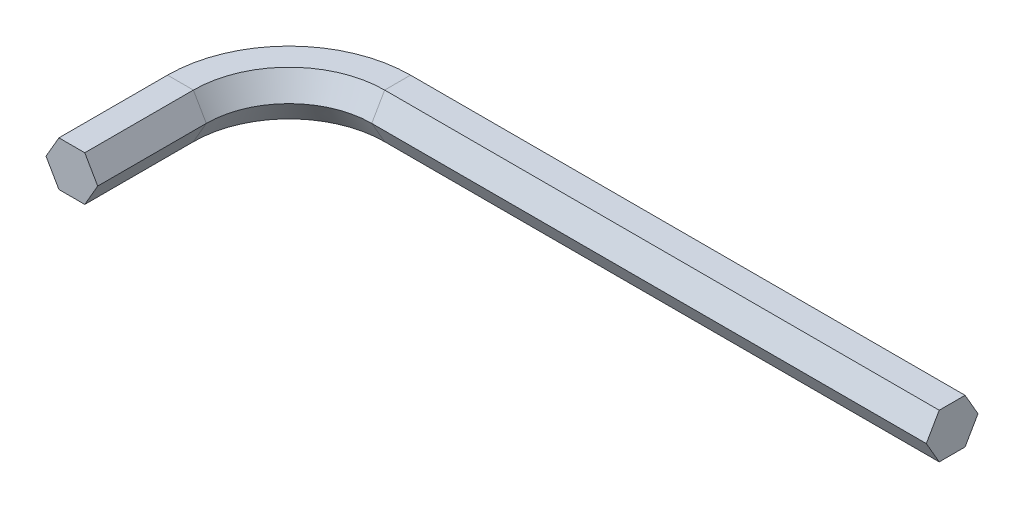
ISO-10303-21;
HEADER;
FILE_DESCRIPTION(('STEP AP214'),'2;1');
FILE_NAME('part.step','',(''),(''),'','','');
FILE_SCHEMA(('AUTOMOTIVE_DESIGN { 1 0 10303 214 1 1 1 1 }'));
ENDSEC;
DATA;
#1=APPLICATION_CONTEXT('core data for automotive mechanical design processes');
#2=APPLICATION_PROTOCOL_DEFINITION('international standard','automotive_design',2000,#1);
#3=PRODUCT_CONTEXT('',#1,'mechanical');
#4=PRODUCT('Part','Part','',(#3));
#5=PRODUCT_RELATED_PRODUCT_CATEGORY('part','',(#4));
#6=PRODUCT_DEFINITION_FORMATION('','',#4);
#7=PRODUCT_DEFINITION_CONTEXT('part definition',#1,'design');
#8=PRODUCT_DEFINITION('design','',#6,#7);
#9=PRODUCT_DEFINITION_SHAPE('','',#8);
#10=(LENGTH_UNIT() NAMED_UNIT(*) SI_UNIT(.MILLI.,.METRE.));
#11=(NAMED_UNIT(*) PLANE_ANGLE_UNIT() SI_UNIT($,.RADIAN.));
#12=(NAMED_UNIT(*) SI_UNIT($,.STERADIAN.) SOLID_ANGLE_UNIT());
#13=UNCERTAINTY_MEASURE_WITH_UNIT(LENGTH_MEASURE(1.E-05),#10,'distance_accuracy_value','');
#14=(GEOMETRIC_REPRESENTATION_CONTEXT(3) GLOBAL_UNCERTAINTY_ASSIGNED_CONTEXT((#13)) GLOBAL_UNIT_ASSIGNED_CONTEXT((#10,
#11,#12)) REPRESENTATION_CONTEXT('',''));
#15=CARTESIAN_POINT('',(0.,0.,0.));
#16=DIRECTION('',(0.,0.,1.));
#17=DIRECTION('',(1.,0.,0.));
#18=AXIS2_PLACEMENT_3D('',#15,#16,#17);
#19=CARTESIAN_POINT('',(0.,0.,0.));
#20=DIRECTION('',(0.,0.,1.));
#21=DIRECTION('',(1.,0.,0.));
#22=AXIS2_PLACEMENT_3D('',#19,#20,#21);
#23=PLANE('',#22);
#24=DIRECTION('',(-0.5,0.866025403784439,0.));
#25=VECTOR('',#24,1.);
#26=CARTESIAN_POINT('',(6.66666666666667,0.,0.));
#27=LINE('',#26,#25);
#28=CARTESIAN_POINT('',(6.66666666666667,0.,0.));
#29=VERTEX_POINT('',#28);
#30=CARTESIAN_POINT('',(3.33333333333333,5.77350269189626,0.));
#31=VERTEX_POINT('',#30);
#32=EDGE_CURVE('E188',#29,#31,#27,.T.);
#33=ORIENTED_EDGE('',*,*,#32,.T.);
#34=DIRECTION('',(-1.,0.,0.));
#35=VECTOR('',#34,1.);
#36=CARTESIAN_POINT('',(3.33333333333333,5.77350269189626,0.));
#37=LINE('',#36,#35);
#38=CARTESIAN_POINT('',(-3.33333333333333,5.77350269189626,0.));
#39=VERTEX_POINT('',#38);
#40=EDGE_CURVE('E147',#31,#39,#37,.T.);
#41=ORIENTED_EDGE('',*,*,#40,.T.);
#42=DIRECTION('',(-0.5,-0.866025403784439,0.));
#43=VECTOR('',#42,1.);
#44=CARTESIAN_POINT('',(-3.33333333333333,5.77350269189626,0.));
#45=LINE('',#44,#43);
#46=CARTESIAN_POINT('',(-6.66666666666667,0.,0.));
#47=VERTEX_POINT('',#46);
#48=EDGE_CURVE('E139',#39,#47,#45,.T.);
#49=ORIENTED_EDGE('',*,*,#48,.T.);
#50=DIRECTION('',(0.5,-0.866025403784439,0.));
#51=VECTOR('',#50,1.);
#52=CARTESIAN_POINT('',(-6.66666666666667,0.,0.));
#53=LINE('',#52,#51);
#54=CARTESIAN_POINT('',(-3.33333333333334,-5.77350269189626,0.));
#55=VERTEX_POINT('',#54);
#56=EDGE_CURVE('E132',#47,#55,#53,.T.);
#57=ORIENTED_EDGE('',*,*,#56,.T.);
#58=DIRECTION('',(1.,0.,0.));
#59=VECTOR('',#58,1.);
#60=CARTESIAN_POINT('',(-3.33333333333334,-5.77350269189626,0.));
#61=LINE('',#60,#59);
#62=CARTESIAN_POINT('',(3.33333333333333,-5.77350269189626,0.));
#63=VERTEX_POINT('',#62);
#64=EDGE_CURVE('E213',#55,#63,#61,.T.);
#65=ORIENTED_EDGE('',*,*,#64,.T.);
#66=DIRECTION('',(0.5,0.866025403784439,0.));
#67=VECTOR('',#66,1.);
#68=CARTESIAN_POINT('',(3.33333333333333,-5.77350269189626,0.));
#69=LINE('',#68,#67);
#70=EDGE_CURVE('E227',#63,#29,#69,.T.);
#71=ORIENTED_EDGE('',*,*,#70,.T.);
#72=EDGE_LOOP('',(#33,#41,#49,#57,#65,#71));
#73=FACE_BOUND('',#72,.T.);
#74=ADVANCED_FACE('F33',(#73),#23,.T.);
#75=CARTESIAN_POINT('',(171.,0.,-56.));
#76=DIRECTION('',(-1.,0.,0.));
#77=DIRECTION('',(0.,0.,1.));
#78=AXIS2_PLACEMENT_3D('',#75,#76,#77);
#79=PLANE('',#78);
#80=DIRECTION('',(0.,0.866025403784439,-0.5));
#81=VECTOR('',#80,1.);
#82=CARTESIAN_POINT('',(171.,0.,-49.3333333333333));
#83=LINE('',#82,#81);
#84=CARTESIAN_POINT('',(171.,0.,-49.3333333333333));
#85=VERTEX_POINT('',#84);
#86=CARTESIAN_POINT('',(171.,5.77350269189626,-52.6666666666667));
#87=VERTEX_POINT('',#86);
#88=EDGE_CURVE('E161',#85,#87,#83,.T.);
#89=ORIENTED_EDGE('',*,*,#88,.F.);
#90=DIRECTION('',(0.,0.866025403784439,0.5));
#91=VECTOR('',#90,1.);
#92=CARTESIAN_POINT('',(171.,-5.77350269189626,-52.6666666666667));
#93=LINE('',#92,#91);
#94=CARTESIAN_POINT('',(171.,-5.77350269189626,-52.6666666666667));
#95=VERTEX_POINT('',#94);
#96=EDGE_CURVE('E11',#95,#85,#93,.T.);
#97=ORIENTED_EDGE('',*,*,#96,.F.);
#98=DIRECTION('',(0.,0.,1.));
#99=VECTOR('',#98,1.);
#100=CARTESIAN_POINT('',(171.,-5.77350269189626,-59.3333333333333));
#101=LINE('',#100,#99);
#102=CARTESIAN_POINT('',(171.,-5.77350269189626,-59.3333333333333));
#103=VERTEX_POINT('',#102);
#104=EDGE_CURVE('E47',#103,#95,#101,.T.);
#105=ORIENTED_EDGE('',*,*,#104,.F.);
#106=DIRECTION('',(0.,-0.866025403784439,0.5));
#107=VECTOR('',#106,1.);
#108=CARTESIAN_POINT('',(171.,0.,-62.6666666666667));
#109=LINE('',#108,#107);
#110=CARTESIAN_POINT('',(171.,0.,-62.6666666666667));
#111=VERTEX_POINT('',#110);
#112=EDGE_CURVE('E56',#111,#103,#109,.T.);
#113=ORIENTED_EDGE('',*,*,#112,.F.);
#114=DIRECTION('',(0.,-0.866025403784439,-0.5));
#115=VECTOR('',#114,1.);
#116=CARTESIAN_POINT('',(171.,5.77350269189626,-59.3333333333333));
#117=LINE('',#116,#115);
#118=CARTESIAN_POINT('',(171.,5.77350269189626,-59.3333333333333));
#119=VERTEX_POINT('',#118);
#120=EDGE_CURVE('E174',#119,#111,#117,.T.);
#121=ORIENTED_EDGE('',*,*,#120,.F.);
#122=DIRECTION('',(0.,0.,-1.));
#123=VECTOR('',#122,1.);
#124=CARTESIAN_POINT('',(171.,5.77350269189626,-52.6666666666667));
#125=LINE('',#124,#123);
#126=EDGE_CURVE('E172',#87,#119,#125,.T.);
#127=ORIENTED_EDGE('',*,*,#126,.F.);
#128=EDGE_LOOP('',(#89,#97,#105,#113,#121,#127));
#129=FACE_BOUND('',#128,.T.);
#130=ADVANCED_FACE('F173',(#129),#79,.F.);
#131=CARTESIAN_POINT('',(6.66666666666667,0.,0.));
#132=DIRECTION('',(-0.866025403784439,-0.5,0.));
#133=DIRECTION('',(0.5,-0.866025403784439,0.));
#134=AXIS2_PLACEMENT_3D('',#131,#132,#133);
#135=PLANE('',#134);
#136=DIRECTION('',(0.,0.,-1.));
#137=VECTOR('',#136,1.);
#138=CARTESIAN_POINT('',(3.33333333333333,5.77350269189626,0.));
#139=LINE('',#138,#137);
#140=CARTESIAN_POINT('',(3.33333333333333,5.77350269189626,-28.));
#141=VERTEX_POINT('',#140);
#142=EDGE_CURVE('E193',#31,#141,#139,.T.);
#143=ORIENTED_EDGE('',*,*,#142,.F.);
#144=ORIENTED_EDGE('',*,*,#32,.F.);
#145=DIRECTION('',(0.,0.,-1.));
#146=VECTOR('',#145,1.);
#147=CARTESIAN_POINT('',(6.66666666666667,0.,0.));
#148=LINE('',#147,#146);
#149=CARTESIAN_POINT('',(6.66666666666667,0.,-28.));
#150=VERTEX_POINT('',#149);
#151=EDGE_CURVE('E243',#29,#150,#148,.T.);
#152=ORIENTED_EDGE('',*,*,#151,.T.);
#153=DIRECTION('',(-0.5,0.866025403784439,0.));
#154=VECTOR('',#153,1.);
#155=CARTESIAN_POINT('',(6.66666666666667,0.,-28.));
#156=LINE('',#155,#154);
#157=EDGE_CURVE('E259',#150,#141,#156,.T.);
#158=ORIENTED_EDGE('',*,*,#157,.T.);
#159=EDGE_LOOP('',(#143,#144,#152,#158));
#160=FACE_BOUND('',#159,.T.);
#161=ADVANCED_FACE('F270',(#160),#135,.F.);
#162=CARTESIAN_POINT('',(3.33333333333333,5.77350269189626,0.));
#163=DIRECTION('',(0.,-1.,0.));
#164=DIRECTION('',(1.,0.,0.));
#165=AXIS2_PLACEMENT_3D('',#162,#163,#164);
#166=PLANE('',#165);
#167=DIRECTION('',(0.,0.,-1.));
#168=VECTOR('',#167,1.);
#169=CARTESIAN_POINT('',(-3.33333333333333,5.77350269189626,0.));
#170=LINE('',#169,#168);
#171=CARTESIAN_POINT('',(-3.33333333333333,5.77350269189626,-28.));
#172=VERTEX_POINT('',#171);
#173=EDGE_CURVE('E192',#39,#172,#170,.T.);
#174=ORIENTED_EDGE('',*,*,#173,.F.);
#175=ORIENTED_EDGE('',*,*,#40,.F.);
#176=ORIENTED_EDGE('',*,*,#142,.T.);
#177=DIRECTION('',(-1.,0.,0.));
#178=VECTOR('',#177,1.);
#179=CARTESIAN_POINT('',(3.33333333333333,5.77350269189626,-28.));
#180=LINE('',#179,#178);
#181=EDGE_CURVE('E189',#141,#172,#180,.T.);
#182=ORIENTED_EDGE('',*,*,#181,.T.);
#183=EDGE_LOOP('',(#174,#175,#176,#182));
#184=FACE_BOUND('',#183,.T.);
#185=ADVANCED_FACE('F271',(#184),#166,.F.);
#186=CARTESIAN_POINT('',(-3.33333333333333,5.77350269189626,0.));
#187=DIRECTION('',(0.866025403784439,-0.5,0.));
#188=DIRECTION('',(0.5,0.866025403784439,0.));
#189=AXIS2_PLACEMENT_3D('',#186,#187,#188);
#190=PLANE('',#189);
#191=DIRECTION('',(0.,0.,-1.));
#192=VECTOR('',#191,1.);
#193=CARTESIAN_POINT('',(-6.66666666666667,0.,0.));
#194=LINE('',#193,#192);
#195=CARTESIAN_POINT('',(-6.66666666666667,0.,-28.));
#196=VERTEX_POINT('',#195);
#197=EDGE_CURVE('E204',#47,#196,#194,.T.);
#198=ORIENTED_EDGE('',*,*,#197,.F.);
#199=ORIENTED_EDGE('',*,*,#48,.F.);
#200=ORIENTED_EDGE('',*,*,#173,.T.);
#201=DIRECTION('',(-0.5,-0.866025403784439,0.));
#202=VECTOR('',#201,1.);
#203=CARTESIAN_POINT('',(-3.33333333333333,5.77350269189626,-28.));
#204=LINE('',#203,#202);
#205=EDGE_CURVE('E195',#172,#196,#204,.T.);
#206=ORIENTED_EDGE('',*,*,#205,.T.);
#207=EDGE_LOOP('',(#198,#199,#200,#206));
#208=FACE_BOUND('',#207,.T.);
#209=ADVANCED_FACE('F324',(#208),#190,.F.);
#210=CARTESIAN_POINT('',(-6.66666666666667,0.,0.));
#211=DIRECTION('',(0.866025403784439,0.5,0.));
#212=DIRECTION('',(-0.5,0.866025403784439,0.));
#213=AXIS2_PLACEMENT_3D('',#210,#211,#212);
#214=PLANE('',#213);
#215=DIRECTION('',(0.,0.,-1.));
#216=VECTOR('',#215,1.);
#217=CARTESIAN_POINT('',(-3.33333333333334,-5.77350269189626,0.));
#218=LINE('',#217,#216);
#219=CARTESIAN_POINT('',(-3.33333333333334,-5.77350269189626,-28.));
#220=VERTEX_POINT('',#219);
#221=EDGE_CURVE('E216',#55,#220,#218,.T.);
#222=ORIENTED_EDGE('',*,*,#221,.F.);
#223=ORIENTED_EDGE('',*,*,#56,.F.);
#224=ORIENTED_EDGE('',*,*,#197,.T.);
#225=DIRECTION('',(0.5,-0.866025403784439,0.));
#226=VECTOR('',#225,1.);
#227=CARTESIAN_POINT('',(-6.66666666666667,0.,-28.));
#228=LINE('',#227,#226);
#229=EDGE_CURVE('E206',#196,#220,#228,.T.);
#230=ORIENTED_EDGE('',*,*,#229,.T.);
#231=EDGE_LOOP('',(#222,#223,#224,#230));
#232=FACE_BOUND('',#231,.T.);
#233=ADVANCED_FACE('F332',(#232),#214,.F.);
#234=CARTESIAN_POINT('',(-3.33333333333334,-5.77350269189626,0.));
#235=DIRECTION('',(0.,1.,0.));
#236=DIRECTION('',(-1.,0.,0.));
#237=AXIS2_PLACEMENT_3D('',#234,#235,#236);
#238=PLANE('',#237);
#239=DIRECTION('',(0.,0.,-1.));
#240=VECTOR('',#239,1.);
#241=CARTESIAN_POINT('',(3.33333333333333,-5.77350269189626,0.));
#242=LINE('',#241,#240);
#243=CARTESIAN_POINT('',(3.33333333333333,-5.77350269189626,-28.));
#244=VERTEX_POINT('',#243);
#245=EDGE_CURVE('E230',#63,#244,#242,.T.);
#246=ORIENTED_EDGE('',*,*,#245,.F.);
#247=ORIENTED_EDGE('',*,*,#64,.F.);
#248=ORIENTED_EDGE('',*,*,#221,.T.);
#249=DIRECTION('',(1.,0.,0.));
#250=VECTOR('',#249,1.);
#251=CARTESIAN_POINT('',(-3.33333333333334,-5.77350269189626,-28.));
#252=LINE('',#251,#250);
#253=EDGE_CURVE('E219',#220,#244,#252,.T.);
#254=ORIENTED_EDGE('',*,*,#253,.T.);
#255=EDGE_LOOP('',(#246,#247,#248,#254));
#256=FACE_BOUND('',#255,.T.);
#257=ADVANCED_FACE('F341',(#256),#238,.F.);
#258=CARTESIAN_POINT('',(3.33333333333333,-5.77350269189626,0.));
#259=DIRECTION('',(-0.866025403784439,0.5,0.));
#260=DIRECTION('',(-0.5,-0.866025403784439,0.));
#261=AXIS2_PLACEMENT_3D('',#258,#259,#260);
#262=PLANE('',#261);
#263=DIRECTION('',(0.5,0.866025403784439,0.));
#264=VECTOR('',#263,1.);
#265=CARTESIAN_POINT('',(3.33333333333333,-5.77350269189626,-28.));
#266=LINE('',#265,#264);
#267=EDGE_CURVE('E233',#244,#150,#266,.T.);
#268=ORIENTED_EDGE('',*,*,#267,.T.);
#269=ORIENTED_EDGE('',*,*,#151,.F.);
#270=ORIENTED_EDGE('',*,*,#70,.F.);
#271=ORIENTED_EDGE('',*,*,#245,.T.);
#272=EDGE_LOOP('',(#268,#269,#270,#271));
#273=FACE_BOUND('',#272,.T.);
#274=ADVANCED_FACE('F282',(#273),#262,.F.);
#275=CARTESIAN_POINT('',(28.,0.,-28.));
#276=DIRECTION('',(0.,1.,0.));
#277=DIRECTION('',(0.,0.,1.));
#278=AXIS2_PLACEMENT_3D('',#275,#276,#277);
#279=CONICAL_SURFACE('',#278,21.3333333333333,0.523598775598298);
#280=CARTESIAN_POINT('',(28.,5.77350269189626,-28.));
#281=DIRECTION('',(0.,-1.,0.));
#282=DIRECTION('',(-1.,0.,0.));
#283=AXIS2_PLACEMENT_3D('',#280,#281,#282);
#284=CIRCLE('',#283,24.6666666666667);
#285=CARTESIAN_POINT('',(28.,5.77350269189626,-52.6666666666667));
#286=VERTEX_POINT('',#285);
#287=EDGE_CURVE('E197',#141,#286,#284,.T.);
#288=ORIENTED_EDGE('',*,*,#287,.F.);
#289=ORIENTED_EDGE('',*,*,#157,.F.);
#290=CARTESIAN_POINT('',(28.,0.,-28.));
#291=DIRECTION('',(0.,-1.,0.));
#292=DIRECTION('',(-1.,0.,0.));
#293=AXIS2_PLACEMENT_3D('',#290,#291,#292);
#294=CIRCLE('',#293,21.3333333333333);
#295=CARTESIAN_POINT('',(28.,0.,-49.3333333333333));
#296=VERTEX_POINT('',#295);
#297=EDGE_CURVE('E245',#150,#296,#294,.T.);
#298=ORIENTED_EDGE('',*,*,#297,.T.);
#299=DIRECTION('',(0.,0.866025403784439,-0.5));
#300=VECTOR('',#299,1.);
#301=CARTESIAN_POINT('',(28.,0.,-49.3333333333333));
#302=LINE('',#301,#300);
#303=EDGE_CURVE('E253',#296,#286,#302,.T.);
#304=ORIENTED_EDGE('',*,*,#303,.T.);
#305=EDGE_LOOP('',(#288,#289,#298,#304));
#306=FACE_BOUND('',#305,.T.);
#307=ADVANCED_FACE('F257',(#306),#279,.F.);
#308=CARTESIAN_POINT('',(3.33333333333333,5.77350269189626,-28.));
#309=DIRECTION('',(0.,-1.,0.));
#310=DIRECTION('',(0.,0.,-1.));
#311=AXIS2_PLACEMENT_3D('',#308,#309,#310);
#312=PLANE('',#311);
#313=CARTESIAN_POINT('',(28.,5.77350269189626,-28.));
#314=DIRECTION('',(0.,-1.,0.));
#315=DIRECTION('',(-1.,0.,0.));
#316=AXIS2_PLACEMENT_3D('',#313,#314,#315);
#317=CIRCLE('',#316,31.3333333333333);
#318=CARTESIAN_POINT('',(28.,5.77350269189626,-59.3333333333333));
#319=VERTEX_POINT('',#318);
#320=EDGE_CURVE('E119',#172,#319,#317,.T.);
#321=ORIENTED_EDGE('',*,*,#320,.F.);
#322=ORIENTED_EDGE('',*,*,#181,.F.);
#323=ORIENTED_EDGE('',*,*,#287,.T.);
#324=DIRECTION('',(0.,0.,-1.));
#325=VECTOR('',#324,1.);
#326=CARTESIAN_POINT('',(28.,5.77350269189626,-52.6666666666667));
#327=LINE('',#326,#325);
#328=EDGE_CURVE('E180',#286,#319,#327,.T.);
#329=ORIENTED_EDGE('',*,*,#328,.T.);
#330=EDGE_LOOP('',(#321,#322,#323,#329));
#331=FACE_BOUND('',#330,.T.);
#332=ADVANCED_FACE('F272',(#331),#312,.F.);
#333=CARTESIAN_POINT('',(28.,5.77350269189626,-28.));
#334=DIRECTION('',(0.,-1.,0.));
#335=DIRECTION('',(0.,0.,-1.));
#336=AXIS2_PLACEMENT_3D('',#333,#334,#335);
#337=CONICAL_SURFACE('',#336,31.3333333333333,0.523598775598299);
#338=CARTESIAN_POINT('',(28.,0.,-28.));
#339=DIRECTION('',(0.,-1.,0.));
#340=DIRECTION('',(-1.,0.,0.));
#341=AXIS2_PLACEMENT_3D('',#338,#339,#340);
#342=CIRCLE('',#341,34.6666666666667);
#343=CARTESIAN_POINT('',(28.,0.,-62.6666666666667));
#344=VERTEX_POINT('',#343);
#345=EDGE_CURVE('E111',#196,#344,#342,.T.);
#346=ORIENTED_EDGE('',*,*,#345,.F.);
#347=ORIENTED_EDGE('',*,*,#205,.F.);
#348=ORIENTED_EDGE('',*,*,#320,.T.);
#349=DIRECTION('',(0.,-0.866025403784439,-0.5));
#350=VECTOR('',#349,1.);
#351=CARTESIAN_POINT('',(28.,5.77350269189626,-59.3333333333333));
#352=LINE('',#351,#350);
#353=EDGE_CURVE('E198',#319,#344,#352,.T.);
#354=ORIENTED_EDGE('',*,*,#353,.T.);
#355=EDGE_LOOP('',(#346,#347,#348,#354));
#356=FACE_BOUND('',#355,.T.);
#357=ADVANCED_FACE('F274',(#356),#337,.T.);
#358=CARTESIAN_POINT('',(28.,0.,-28.));
#359=DIRECTION('',(0.,1.,0.));
#360=DIRECTION('',(0.,0.,1.));
#361=AXIS2_PLACEMENT_3D('',#358,#359,#360);
#362=CONICAL_SURFACE('',#361,34.6666666666667,0.523598775598299);
#363=CARTESIAN_POINT('',(28.,-5.77350269189626,-28.));
#364=DIRECTION('',(0.,-1.,0.));
#365=DIRECTION('',(-1.,0.,0.));
#366=AXIS2_PLACEMENT_3D('',#363,#364,#365);
#367=CIRCLE('',#366,31.3333333333333);
#368=CARTESIAN_POINT('',(28.,-5.77350269189626,-59.3333333333333));
#369=VERTEX_POINT('',#368);
#370=EDGE_CURVE('E103',#220,#369,#367,.T.);
#371=ORIENTED_EDGE('',*,*,#370,.F.);
#372=ORIENTED_EDGE('',*,*,#229,.F.);
#373=ORIENTED_EDGE('',*,*,#345,.T.);
#374=DIRECTION('',(0.,-0.866025403784439,0.5));
#375=VECTOR('',#374,1.);
#376=CARTESIAN_POINT('',(28.,0.,-62.6666666666667));
#377=LINE('',#376,#375);
#378=EDGE_CURVE('E209',#344,#369,#377,.T.);
#379=ORIENTED_EDGE('',*,*,#378,.T.);
#380=EDGE_LOOP('',(#371,#372,#373,#379));
#381=FACE_BOUND('',#380,.T.);
#382=ADVANCED_FACE('F280',(#381),#362,.T.);
#383=CARTESIAN_POINT('',(-3.33333333333334,-5.77350269189626,-28.));
#384=DIRECTION('',(0.,1.,0.));
#385=DIRECTION('',(0.,0.,1.));
#386=AXIS2_PLACEMENT_3D('',#383,#384,#385);
#387=PLANE('',#386);
#388=CARTESIAN_POINT('',(28.,-5.77350269189626,-28.));
#389=DIRECTION('',(0.,-1.,0.));
#390=DIRECTION('',(-1.,0.,0.));
#391=AXIS2_PLACEMENT_3D('',#388,#389,#390);
#392=CIRCLE('',#391,24.6666666666667);
#393=CARTESIAN_POINT('',(28.,-5.77350269189626,-52.6666666666667));
#394=VERTEX_POINT('',#393);
#395=EDGE_CURVE('E236',#244,#394,#392,.T.);
#396=ORIENTED_EDGE('',*,*,#395,.F.);
#397=ORIENTED_EDGE('',*,*,#253,.F.);
#398=ORIENTED_EDGE('',*,*,#370,.T.);
#399=DIRECTION('',(0.,0.,1.));
#400=VECTOR('',#399,1.);
#401=CARTESIAN_POINT('',(28.,-5.77350269189626,-59.3333333333333));
#402=LINE('',#401,#400);
#403=EDGE_CURVE('E222',#369,#394,#402,.T.);
#404=ORIENTED_EDGE('',*,*,#403,.T.);
#405=EDGE_LOOP('',(#396,#397,#398,#404));
#406=FACE_BOUND('',#405,.T.);
#407=ADVANCED_FACE('F383',(#406),#387,.F.);
#408=CARTESIAN_POINT('',(28.,-5.77350269189626,-28.));
#409=DIRECTION('',(0.,-1.,0.));
#410=DIRECTION('',(0.,0.,-1.));
#411=AXIS2_PLACEMENT_3D('',#408,#409,#410);
#412=CONICAL_SURFACE('',#411,24.6666666666667,0.523598775598299);
#413=DIRECTION('',(0.,0.866025403784439,0.5));
#414=VECTOR('',#413,1.);
#415=CARTESIAN_POINT('',(28.,-5.77350269189626,-52.6666666666667));
#416=LINE('',#415,#414);
#417=EDGE_CURVE('E186',#394,#296,#416,.T.);
#418=ORIENTED_EDGE('',*,*,#417,.T.);
#419=ORIENTED_EDGE('',*,*,#297,.F.);
#420=ORIENTED_EDGE('',*,*,#267,.F.);
#421=ORIENTED_EDGE('',*,*,#395,.T.);
#422=EDGE_LOOP('',(#418,#419,#420,#421));
#423=FACE_BOUND('',#422,.T.);
#424=ADVANCED_FACE('F248',(#423),#412,.F.);
#425=CARTESIAN_POINT('',(28.,0.,-49.3333333333333));
#426=DIRECTION('',(0.,-0.5,-0.866025403784439));
#427=DIRECTION('',(0.,0.866025403784439,-0.5));
#428=AXIS2_PLACEMENT_3D('',#425,#426,#427);
#429=PLANE('',#428);
#430=DIRECTION('',(1.,0.,0.));
#431=VECTOR('',#430,1.);
#432=CARTESIAN_POINT('',(28.,5.77350269189626,-52.6666666666667));
#433=LINE('',#432,#431);
#434=EDGE_CURVE('E166',#286,#87,#433,.T.);
#435=ORIENTED_EDGE('',*,*,#434,.F.);
#436=ORIENTED_EDGE('',*,*,#303,.F.);
#437=DIRECTION('',(1.,0.,0.));
#438=VECTOR('',#437,1.);
#439=CARTESIAN_POINT('',(28.,0.,-49.3333333333333));
#440=LINE('',#439,#438);
#441=EDGE_CURVE('E168',#296,#85,#440,.T.);
#442=ORIENTED_EDGE('',*,*,#441,.T.);
#443=ORIENTED_EDGE('',*,*,#88,.T.);
#444=EDGE_LOOP('',(#435,#436,#442,#443));
#445=FACE_BOUND('',#444,.T.);
#446=ADVANCED_FACE('F163',(#445),#429,.F.);
#447=CARTESIAN_POINT('',(28.,5.77350269189626,-52.6666666666667));
#448=DIRECTION('',(0.,-1.,0.));
#449=DIRECTION('',(0.,0.,-1.));
#450=AXIS2_PLACEMENT_3D('',#447,#448,#449);
#451=PLANE('',#450);
#452=DIRECTION('',(1.,0.,0.));
#453=VECTOR('',#452,1.);
#454=CARTESIAN_POINT('',(28.,5.77350269189626,-59.3333333333333));
#455=LINE('',#454,#453);
#456=EDGE_CURVE('E177',#319,#119,#455,.T.);
#457=ORIENTED_EDGE('',*,*,#456,.F.);
#458=ORIENTED_EDGE('',*,*,#328,.F.);
#459=ORIENTED_EDGE('',*,*,#434,.T.);
#460=ORIENTED_EDGE('',*,*,#126,.T.);
#461=EDGE_LOOP('',(#457,#458,#459,#460));
#462=FACE_BOUND('',#461,.T.);
#463=ADVANCED_FACE('F179',(#462),#451,.F.);
#464=CARTESIAN_POINT('',(28.,5.77350269189626,-59.3333333333333));
#465=DIRECTION('',(0.,-0.5,0.866025403784439));
#466=DIRECTION('',(0.,-0.866025403784439,-0.5));
#467=AXIS2_PLACEMENT_3D('',#464,#465,#466);
#468=PLANE('',#467);
#469=DIRECTION('',(1.,0.,0.));
#470=VECTOR('',#469,1.);
#471=CARTESIAN_POINT('',(28.,0.,-62.6666666666667));
#472=LINE('',#471,#470);
#473=EDGE_CURVE('E88',#344,#111,#472,.T.);
#474=ORIENTED_EDGE('',*,*,#473,.F.);
#475=ORIENTED_EDGE('',*,*,#353,.F.);
#476=ORIENTED_EDGE('',*,*,#456,.T.);
#477=ORIENTED_EDGE('',*,*,#120,.T.);
#478=EDGE_LOOP('',(#474,#475,#476,#477));
#479=FACE_BOUND('',#478,.T.);
#480=ADVANCED_FACE('F416',(#479),#468,.F.);
#481=CARTESIAN_POINT('',(28.,0.,-62.6666666666667));
#482=DIRECTION('',(0.,0.5,0.866025403784439));
#483=DIRECTION('',(0.,-0.866025403784439,0.5));
#484=AXIS2_PLACEMENT_3D('',#481,#482,#483);
#485=PLANE('',#484);
#486=DIRECTION('',(1.,0.,0.));
#487=VECTOR('',#486,1.);
#488=CARTESIAN_POINT('',(28.,-5.77350269189626,-59.3333333333333));
#489=LINE('',#488,#487);
#490=EDGE_CURVE('E82',#369,#103,#489,.T.);
#491=ORIENTED_EDGE('',*,*,#490,.F.);
#492=ORIENTED_EDGE('',*,*,#378,.F.);
#493=ORIENTED_EDGE('',*,*,#473,.T.);
#494=ORIENTED_EDGE('',*,*,#112,.T.);
#495=EDGE_LOOP('',(#491,#492,#493,#494));
#496=FACE_BOUND('',#495,.T.);
#497=ADVANCED_FACE('F293',(#496),#485,.F.);
#498=CARTESIAN_POINT('',(28.,-5.77350269189626,-59.3333333333333));
#499=DIRECTION('',(0.,1.,0.));
#500=DIRECTION('',(0.,0.,1.));
#501=AXIS2_PLACEMENT_3D('',#498,#499,#500);
#502=PLANE('',#501);
#503=DIRECTION('',(1.,0.,0.));
#504=VECTOR('',#503,1.);
#505=CARTESIAN_POINT('',(28.,-5.77350269189626,-52.6666666666667));
#506=LINE('',#505,#504);
#507=EDGE_CURVE('E40',#394,#95,#506,.T.);
#508=ORIENTED_EDGE('',*,*,#507,.F.);
#509=ORIENTED_EDGE('',*,*,#403,.F.);
#510=ORIENTED_EDGE('',*,*,#490,.T.);
#511=ORIENTED_EDGE('',*,*,#104,.T.);
#512=EDGE_LOOP('',(#508,#509,#510,#511));
#513=FACE_BOUND('',#512,.T.);
#514=ADVANCED_FACE('F288',(#513),#502,.F.);
#515=CARTESIAN_POINT('',(28.,-5.77350269189626,-52.6666666666667));
#516=DIRECTION('',(0.,0.5,-0.866025403784439));
#517=DIRECTION('',(0.,0.866025403784439,0.5));
#518=AXIS2_PLACEMENT_3D('',#515,#516,#517);
#519=PLANE('',#518);
#520=ORIENTED_EDGE('',*,*,#96,.T.);
#521=ORIENTED_EDGE('',*,*,#441,.F.);
#522=ORIENTED_EDGE('',*,*,#417,.F.);
#523=ORIENTED_EDGE('',*,*,#507,.T.);
#524=EDGE_LOOP('',(#520,#521,#522,#523));
#525=FACE_BOUND('',#524,.T.);
#526=ADVANCED_FACE('F286',(#525),#519,.F.);
#527=CLOSED_SHELL('',(#74,#130,#161,#185,#209,#233,#257,#274,#307,#332,#357,#382,#407,#424,#446,
#463,#480,#497,#514,#526));
#528=MANIFOLD_SOLID_BREP('B2',#527);
#529=ADVANCED_BREP_SHAPE_REPRESENTATION('',(#18,#528),#14);
#530=SHAPE_DEFINITION_REPRESENTATION(#9,#529);
ENDSEC;
END-ISO-10303-21;
